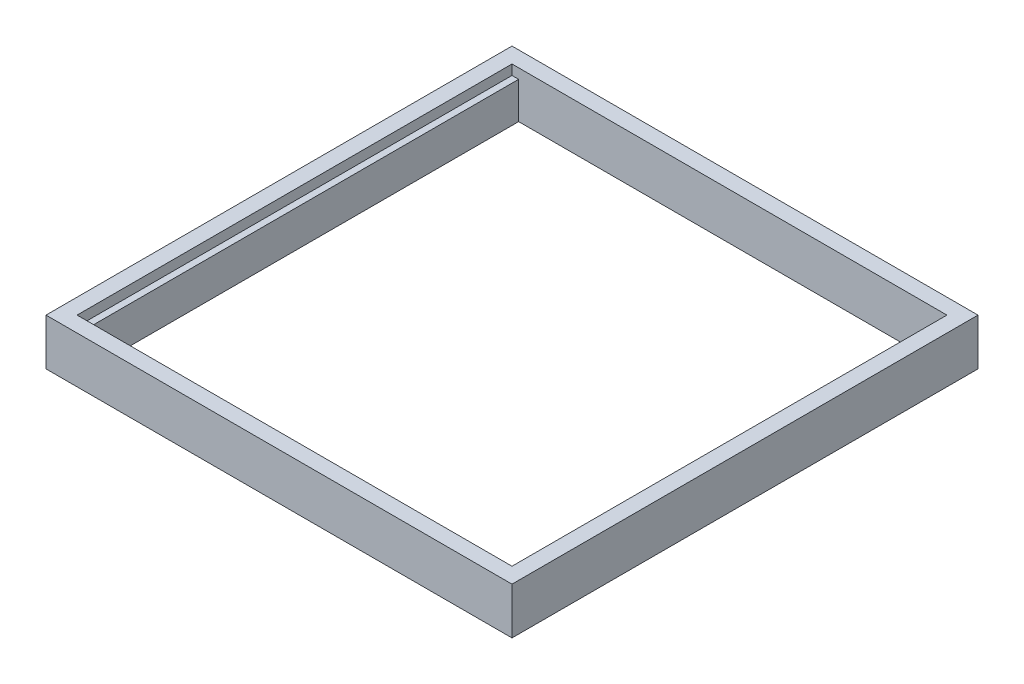
ISO-10303-21;
HEADER;
FILE_DESCRIPTION(('STEP AP214'),'2;1');
FILE_NAME('part.step','',(''),(''),'','','');
FILE_SCHEMA(('AUTOMOTIVE_DESIGN { 1 0 10303 214 1 1 1 1 }'));
ENDSEC;
DATA;
#1=APPLICATION_CONTEXT('core data for automotive mechanical design processes');
#2=APPLICATION_PROTOCOL_DEFINITION('international standard','automotive_design',2000,#1);
#3=PRODUCT_CONTEXT('',#1,'mechanical');
#4=PRODUCT('Part','Part','',(#3));
#5=PRODUCT_RELATED_PRODUCT_CATEGORY('part','',(#4));
#6=PRODUCT_DEFINITION_FORMATION('','',#4);
#7=PRODUCT_DEFINITION_CONTEXT('part definition',#1,'design');
#8=PRODUCT_DEFINITION('design','',#6,#7);
#9=PRODUCT_DEFINITION_SHAPE('','',#8);
#10=(LENGTH_UNIT() NAMED_UNIT(*) SI_UNIT(.MILLI.,.METRE.));
#11=(NAMED_UNIT(*) PLANE_ANGLE_UNIT() SI_UNIT($,.RADIAN.));
#12=(NAMED_UNIT(*) SI_UNIT($,.STERADIAN.) SOLID_ANGLE_UNIT());
#13=UNCERTAINTY_MEASURE_WITH_UNIT(LENGTH_MEASURE(1.E-05),#10,'distance_accuracy_value','');
#14=(GEOMETRIC_REPRESENTATION_CONTEXT(3) GLOBAL_UNCERTAINTY_ASSIGNED_CONTEXT((#13)) GLOBAL_UNIT_ASSIGNED_CONTEXT((#10,
#11,#12)) REPRESENTATION_CONTEXT('',''));
#15=CARTESIAN_POINT('',(0.,0.,0.));
#16=DIRECTION('',(0.,0.,1.));
#17=DIRECTION('',(1.,0.,0.));
#18=AXIS2_PLACEMENT_3D('',#15,#16,#17);
#19=CARTESIAN_POINT('',(0.,5.9,0.));
#20=DIRECTION('',(0.,-1.,0.));
#21=DIRECTION('',(0.,0.,-1.));
#22=AXIS2_PLACEMENT_3D('',#19,#20,#21);
#23=PLANE('',#22);
#24=DIRECTION('',(0.,0.,-1.));
#25=VECTOR('',#24,1.);
#26=CARTESIAN_POINT('',(33.9290042476694,5.9,35.));
#27=LINE('',#26,#25);
#28=CARTESIAN_POINT('',(33.9290042476694,5.9,35.));
#29=VERTEX_POINT('',#28);
#30=CARTESIAN_POINT('',(33.9290042476694,5.9,-35.));
#31=VERTEX_POINT('',#30);
#32=EDGE_CURVE('E148',#29,#31,#27,.T.);
#33=ORIENTED_EDGE('',*,*,#32,.F.);
#34=DIRECTION('',(1.,0.,0.));
#35=VECTOR('',#34,1.);
#36=CARTESIAN_POINT('',(-35.,5.9,35.));
#37=LINE('',#36,#35);
#38=CARTESIAN_POINT('',(35.,5.9,35.));
#39=VERTEX_POINT('',#38);
#40=EDGE_CURVE('E170',#29,#39,#37,.T.);
#41=ORIENTED_EDGE('',*,*,#40,.T.);
#42=DIRECTION('',(0.,0.,-1.));
#43=VECTOR('',#42,1.);
#44=CARTESIAN_POINT('',(35.,5.9,35.));
#45=LINE('',#44,#43);
#46=CARTESIAN_POINT('',(35.,5.9,-35.));
#47=VERTEX_POINT('',#46);
#48=EDGE_CURVE('E160',#39,#47,#45,.T.);
#49=ORIENTED_EDGE('',*,*,#48,.T.);
#50=DIRECTION('',(-1.,0.,0.));
#51=VECTOR('',#50,1.);
#52=CARTESIAN_POINT('',(-35.,5.9,-35.));
#53=LINE('',#52,#51);
#54=EDGE_CURVE('E164',#47,#31,#53,.T.);
#55=ORIENTED_EDGE('',*,*,#54,.T.);
#56=EDGE_LOOP('',(#33,#41,#49,#55));
#57=FACE_BOUND('',#56,.T.);
#58=ADVANCED_FACE('F38',(#57),#23,.F.);
#59=DIRECTION('',(0.,0.,1.));
#60=VECTOR('',#59,1.);
#61=CARTESIAN_POINT('',(-33.9290042476694,5.9,35.));
#62=LINE('',#61,#60);
#63=CARTESIAN_POINT('',(-33.9290042476694,5.9,-35.));
#64=VERTEX_POINT('',#63);
#65=CARTESIAN_POINT('',(-33.9290042476694,5.9,35.));
#66=VERTEX_POINT('',#65);
#67=EDGE_CURVE('E146',#64,#66,#62,.T.);
#68=ORIENTED_EDGE('',*,*,#67,.F.);
#69=CARTESIAN_POINT('',(-35.,5.9,-35.));
#70=VERTEX_POINT('',#69);
#71=EDGE_CURVE('E141',#64,#70,#53,.T.);
#72=ORIENTED_EDGE('',*,*,#71,.T.);
#73=DIRECTION('',(0.,0.,1.));
#74=VECTOR('',#73,1.);
#75=CARTESIAN_POINT('',(-35.,5.9,35.));
#76=LINE('',#75,#74);
#77=CARTESIAN_POINT('',(-35.,5.9,35.));
#78=VERTEX_POINT('',#77);
#79=EDGE_CURVE('E167',#70,#78,#76,.T.);
#80=ORIENTED_EDGE('',*,*,#79,.T.);
#81=EDGE_CURVE('E171',#78,#66,#37,.T.);
#82=ORIENTED_EDGE('',*,*,#81,.T.);
#83=EDGE_LOOP('',(#68,#72,#80,#82));
#84=FACE_BOUND('',#83,.T.);
#85=ADVANCED_FACE('F240',(#84),#23,.F.);
#86=CARTESIAN_POINT('',(37.5,7.5,37.5));
#87=DIRECTION('',(-1.,0.,0.));
#88=DIRECTION('',(0.,0.,1.));
#89=AXIS2_PLACEMENT_3D('',#86,#87,#88);
#90=PLANE('',#89);
#91=DIRECTION('',(0.,0.,-1.));
#92=VECTOR('',#91,1.);
#93=CARTESIAN_POINT('',(37.5,0.,37.5));
#94=LINE('',#93,#92);
#95=CARTESIAN_POINT('',(37.5,0.,37.5));
#96=VERTEX_POINT('',#95);
#97=CARTESIAN_POINT('',(37.5,0.,-37.5));
#98=VERTEX_POINT('',#97);
#99=EDGE_CURVE('E185',#96,#98,#94,.T.);
#100=ORIENTED_EDGE('',*,*,#99,.T.);
#101=DIRECTION('',(0.,-1.,0.));
#102=VECTOR('',#101,1.);
#103=CARTESIAN_POINT('',(37.5,7.5,-37.5));
#104=LINE('',#103,#102);
#105=CARTESIAN_POINT('',(37.5,7.5,-37.5));
#106=VERTEX_POINT('',#105);
#107=EDGE_CURVE('E11',#106,#98,#104,.T.);
#108=ORIENTED_EDGE('',*,*,#107,.F.);
#109=DIRECTION('',(0.,0.,-1.));
#110=VECTOR('',#109,1.);
#111=CARTESIAN_POINT('',(37.5,7.5,37.5));
#112=LINE('',#111,#110);
#113=CARTESIAN_POINT('',(37.5,7.5,37.5));
#114=VERTEX_POINT('',#113);
#115=EDGE_CURVE('E192',#114,#106,#112,.T.);
#116=ORIENTED_EDGE('',*,*,#115,.F.);
#117=DIRECTION('',(0.,-1.,0.));
#118=VECTOR('',#117,1.);
#119=CARTESIAN_POINT('',(37.5,7.5,37.5));
#120=LINE('',#119,#118);
#121=EDGE_CURVE('E202',#114,#96,#120,.T.);
#122=ORIENTED_EDGE('',*,*,#121,.T.);
#123=EDGE_LOOP('',(#100,#108,#116,#122));
#124=FACE_BOUND('',#123,.T.);
#125=ADVANCED_FACE('F40',(#124),#90,.F.);
#126=CARTESIAN_POINT('',(-37.5,7.5,-37.5));
#127=DIRECTION('',(0.,0.,1.));
#128=DIRECTION('',(1.,0.,0.));
#129=AXIS2_PLACEMENT_3D('',#126,#127,#128);
#130=PLANE('',#129);
#131=DIRECTION('',(-1.,0.,0.));
#132=VECTOR('',#131,1.);
#133=CARTESIAN_POINT('',(-37.5,0.,-37.5));
#134=LINE('',#133,#132);
#135=CARTESIAN_POINT('',(-37.5,0.,-37.5));
#136=VERTEX_POINT('',#135);
#137=EDGE_CURVE('E205',#98,#136,#134,.T.);
#138=ORIENTED_EDGE('',*,*,#137,.T.);
#139=DIRECTION('',(0.,-1.,0.));
#140=VECTOR('',#139,1.);
#141=CARTESIAN_POINT('',(-37.5,7.5,-37.5));
#142=LINE('',#141,#140);
#143=CARTESIAN_POINT('',(-37.5,7.5,-37.5));
#144=VERTEX_POINT('',#143);
#145=EDGE_CURVE('E46',#144,#136,#142,.T.);
#146=ORIENTED_EDGE('',*,*,#145,.F.);
#147=DIRECTION('',(-1.,0.,0.));
#148=VECTOR('',#147,1.);
#149=CARTESIAN_POINT('',(-37.5,7.5,-37.5));
#150=LINE('',#149,#148);
#151=EDGE_CURVE('E195',#106,#144,#150,.T.);
#152=ORIENTED_EDGE('',*,*,#151,.F.);
#153=ORIENTED_EDGE('',*,*,#107,.T.);
#154=EDGE_LOOP('',(#138,#146,#152,#153));
#155=FACE_BOUND('',#154,.T.);
#156=ADVANCED_FACE('F233',(#155),#130,.F.);
#157=CARTESIAN_POINT('',(-37.5,7.5,37.5));
#158=DIRECTION('',(1.,0.,0.));
#159=DIRECTION('',(0.,0.,-1.));
#160=AXIS2_PLACEMENT_3D('',#157,#158,#159);
#161=PLANE('',#160);
#162=DIRECTION('',(0.,0.,1.));
#163=VECTOR('',#162,1.);
#164=CARTESIAN_POINT('',(-37.5,0.,37.5));
#165=LINE('',#164,#163);
#166=CARTESIAN_POINT('',(-37.5,0.,37.5));
#167=VERTEX_POINT('',#166);
#168=EDGE_CURVE('E207',#136,#167,#165,.T.);
#169=ORIENTED_EDGE('',*,*,#168,.T.);
#170=DIRECTION('',(0.,-1.,0.));
#171=VECTOR('',#170,1.);
#172=CARTESIAN_POINT('',(-37.5,7.5,37.5));
#173=LINE('',#172,#171);
#174=CARTESIAN_POINT('',(-37.5,7.5,37.5));
#175=VERTEX_POINT('',#174);
#176=EDGE_CURVE('E212',#175,#167,#173,.T.);
#177=ORIENTED_EDGE('',*,*,#176,.F.);
#178=DIRECTION('',(0.,0.,1.));
#179=VECTOR('',#178,1.);
#180=CARTESIAN_POINT('',(-37.5,7.5,37.5));
#181=LINE('',#180,#179);
#182=EDGE_CURVE('E198',#144,#175,#181,.T.);
#183=ORIENTED_EDGE('',*,*,#182,.F.);
#184=ORIENTED_EDGE('',*,*,#145,.T.);
#185=EDGE_LOOP('',(#169,#177,#183,#184));
#186=FACE_BOUND('',#185,.T.);
#187=ADVANCED_FACE('F219',(#186),#161,.F.);
#188=CARTESIAN_POINT('',(-37.5,7.5,37.5));
#189=DIRECTION('',(0.,0.,-1.));
#190=DIRECTION('',(-1.,0.,0.));
#191=AXIS2_PLACEMENT_3D('',#188,#189,#190);
#192=PLANE('',#191);
#193=DIRECTION('',(1.,0.,0.));
#194=VECTOR('',#193,1.);
#195=CARTESIAN_POINT('',(-37.5,0.,37.5));
#196=LINE('',#195,#194);
#197=EDGE_CURVE('E196',#167,#96,#196,.T.);
#198=ORIENTED_EDGE('',*,*,#197,.T.);
#199=ORIENTED_EDGE('',*,*,#121,.F.);
#200=DIRECTION('',(1.,0.,0.));
#201=VECTOR('',#200,1.);
#202=CARTESIAN_POINT('',(-37.5,7.5,37.5));
#203=LINE('',#202,#201);
#204=EDGE_CURVE('E200',#175,#114,#203,.T.);
#205=ORIENTED_EDGE('',*,*,#204,.F.);
#206=ORIENTED_EDGE('',*,*,#176,.T.);
#207=EDGE_LOOP('',(#198,#199,#205,#206));
#208=FACE_BOUND('',#207,.T.);
#209=ADVANCED_FACE('F226',(#208),#192,.F.);
#210=CARTESIAN_POINT('',(0.,7.5,0.));
#211=DIRECTION('',(0.,-1.,0.));
#212=DIRECTION('',(0.,0.,-1.));
#213=AXIS2_PLACEMENT_3D('',#210,#211,#212);
#214=PLANE('',#213);
#215=DIRECTION('',(-1.,0.,0.));
#216=VECTOR('',#215,1.);
#217=CARTESIAN_POINT('',(-35.,7.5,-35.));
#218=LINE('',#217,#216);
#219=CARTESIAN_POINT('',(35.,7.5,-35.));
#220=VERTEX_POINT('',#219);
#221=CARTESIAN_POINT('',(-35.,7.5,-35.));
#222=VERTEX_POINT('',#221);
#223=EDGE_CURVE('E176',#220,#222,#218,.T.);
#224=ORIENTED_EDGE('',*,*,#223,.F.);
#225=DIRECTION('',(0.,0.,-1.));
#226=VECTOR('',#225,1.);
#227=CARTESIAN_POINT('',(35.,7.5,35.));
#228=LINE('',#227,#226);
#229=CARTESIAN_POINT('',(35.,7.5,35.));
#230=VERTEX_POINT('',#229);
#231=EDGE_CURVE('E159',#230,#220,#228,.T.);
#232=ORIENTED_EDGE('',*,*,#231,.F.);
#233=DIRECTION('',(1.,0.,0.));
#234=VECTOR('',#233,1.);
#235=CARTESIAN_POINT('',(-35.,7.5,35.));
#236=LINE('',#235,#234);
#237=CARTESIAN_POINT('',(-35.,7.5,35.));
#238=VERTEX_POINT('',#237);
#239=EDGE_CURVE('E163',#238,#230,#236,.T.);
#240=ORIENTED_EDGE('',*,*,#239,.F.);
#241=DIRECTION('',(0.,0.,1.));
#242=VECTOR('',#241,1.);
#243=CARTESIAN_POINT('',(-35.,7.5,35.));
#244=LINE('',#243,#242);
#245=EDGE_CURVE('E178',#222,#238,#244,.T.);
#246=ORIENTED_EDGE('',*,*,#245,.F.);
#247=EDGE_LOOP('',(#224,#232,#240,#246));
#248=FACE_BOUND('',#247,.T.);
#249=ORIENTED_EDGE('',*,*,#115,.T.);
#250=ORIENTED_EDGE('',*,*,#151,.T.);
#251=ORIENTED_EDGE('',*,*,#182,.T.);
#252=ORIENTED_EDGE('',*,*,#204,.T.);
#253=EDGE_LOOP('',(#249,#250,#251,#252));
#254=FACE_BOUND('',#253,.T.);
#255=ADVANCED_FACE('F232',(#248,#254),#214,.F.);
#256=CARTESIAN_POINT('',(0.,0.,0.));
#257=DIRECTION('',(0.,-1.,0.));
#258=DIRECTION('',(0.,0.,-1.));
#259=AXIS2_PLACEMENT_3D('',#256,#257,#258);
#260=PLANE('',#259);
#261=DIRECTION('',(-1.,0.,0.));
#262=VECTOR('',#261,1.);
#263=CARTESIAN_POINT('',(-33.9290042476694,0.,-35.));
#264=LINE('',#263,#262);
#265=CARTESIAN_POINT('',(33.9290042476694,0.,-35.));
#266=VERTEX_POINT('',#265);
#267=CARTESIAN_POINT('',(-33.9290042476694,0.,-35.));
#268=VERTEX_POINT('',#267);
#269=EDGE_CURVE('E138',#266,#268,#264,.T.);
#270=ORIENTED_EDGE('',*,*,#269,.T.);
#271=DIRECTION('',(0.,0.,1.));
#272=VECTOR('',#271,1.);
#273=CARTESIAN_POINT('',(-33.9290042476694,0.,35.));
#274=LINE('',#273,#272);
#275=CARTESIAN_POINT('',(-33.9290042476694,0.,35.));
#276=VERTEX_POINT('',#275);
#277=EDGE_CURVE('E127',#268,#276,#274,.T.);
#278=ORIENTED_EDGE('',*,*,#277,.T.);
#279=DIRECTION('',(1.,0.,0.));
#280=VECTOR('',#279,1.);
#281=CARTESIAN_POINT('',(-33.9290042476694,0.,35.));
#282=LINE('',#281,#280);
#283=CARTESIAN_POINT('',(33.9290042476694,0.,35.));
#284=VERTEX_POINT('',#283);
#285=EDGE_CURVE('E154',#276,#284,#282,.T.);
#286=ORIENTED_EDGE('',*,*,#285,.T.);
#287=DIRECTION('',(0.,0.,-1.));
#288=VECTOR('',#287,1.);
#289=CARTESIAN_POINT('',(33.9290042476694,0.,35.));
#290=LINE('',#289,#288);
#291=EDGE_CURVE('E145',#284,#266,#290,.T.);
#292=ORIENTED_EDGE('',*,*,#291,.T.);
#293=EDGE_LOOP('',(#270,#278,#286,#292));
#294=FACE_BOUND('',#293,.T.);
#295=ORIENTED_EDGE('',*,*,#99,.F.);
#296=ORIENTED_EDGE('',*,*,#197,.F.);
#297=ORIENTED_EDGE('',*,*,#168,.F.);
#298=ORIENTED_EDGE('',*,*,#137,.F.);
#299=EDGE_LOOP('',(#295,#296,#297,#298));
#300=FACE_BOUND('',#299,.T.);
#301=ADVANCED_FACE('F143',(#294,#300),#260,.T.);
#302=CARTESIAN_POINT('',(35.,5.9,35.));
#303=DIRECTION('',(1.,0.,0.));
#304=DIRECTION('',(0.,0.,-1.));
#305=AXIS2_PLACEMENT_3D('',#302,#303,#304);
#306=PLANE('',#305);
#307=ORIENTED_EDGE('',*,*,#231,.T.);
#308=DIRECTION('',(0.,1.,0.));
#309=VECTOR('',#308,1.);
#310=CARTESIAN_POINT('',(35.,5.9,-35.));
#311=LINE('',#310,#309);
#312=EDGE_CURVE('E174',#47,#220,#311,.T.);
#313=ORIENTED_EDGE('',*,*,#312,.F.);
#314=ORIENTED_EDGE('',*,*,#48,.F.);
#315=DIRECTION('',(0.,1.,0.));
#316=VECTOR('',#315,1.);
#317=CARTESIAN_POINT('',(35.,5.9,35.));
#318=LINE('',#317,#316);
#319=EDGE_CURVE('E183',#39,#230,#318,.T.);
#320=ORIENTED_EDGE('',*,*,#319,.T.);
#321=EDGE_LOOP('',(#307,#313,#314,#320));
#322=FACE_BOUND('',#321,.T.);
#323=ADVANCED_FACE('F257',(#322),#306,.F.);
#324=CARTESIAN_POINT('',(-35.,5.9,35.));
#325=DIRECTION('',(0.,0.,1.));
#326=DIRECTION('',(1.,0.,0.));
#327=AXIS2_PLACEMENT_3D('',#324,#325,#326);
#328=PLANE('',#327);
#329=ORIENTED_EDGE('',*,*,#239,.T.);
#330=ORIENTED_EDGE('',*,*,#319,.F.);
#331=ORIENTED_EDGE('',*,*,#40,.F.);
#332=DIRECTION('',(0.,1.,0.));
#333=VECTOR('',#332,1.);
#334=CARTESIAN_POINT('',(33.9290042476694,-97.4920987411465,35.));
#335=LINE('',#334,#333);
#336=EDGE_CURVE('E153',#284,#29,#335,.T.);
#337=ORIENTED_EDGE('',*,*,#336,.F.);
#338=ORIENTED_EDGE('',*,*,#285,.F.);
#339=DIRECTION('',(0.,1.,0.));
#340=VECTOR('',#339,1.);
#341=CARTESIAN_POINT('',(-33.9290042476694,-97.4920987411465,35.));
#342=LINE('',#341,#340);
#343=EDGE_CURVE('E129',#276,#66,#342,.T.);
#344=ORIENTED_EDGE('',*,*,#343,.T.);
#345=ORIENTED_EDGE('',*,*,#81,.F.);
#346=DIRECTION('',(0.,1.,0.));
#347=VECTOR('',#346,1.);
#348=CARTESIAN_POINT('',(-35.,5.9,35.));
#349=LINE('',#348,#347);
#350=EDGE_CURVE('E186',#78,#238,#349,.T.);
#351=ORIENTED_EDGE('',*,*,#350,.T.);
#352=EDGE_LOOP('',(#329,#330,#331,#337,#338,#344,#345,#351));
#353=FACE_BOUND('',#352,.T.);
#354=ADVANCED_FACE('F253',(#353),#328,.F.);
#355=CARTESIAN_POINT('',(-35.,5.9,35.));
#356=DIRECTION('',(-1.,0.,0.));
#357=DIRECTION('',(0.,0.,1.));
#358=AXIS2_PLACEMENT_3D('',#355,#356,#357);
#359=PLANE('',#358);
#360=ORIENTED_EDGE('',*,*,#245,.T.);
#361=ORIENTED_EDGE('',*,*,#350,.F.);
#362=ORIENTED_EDGE('',*,*,#79,.F.);
#363=DIRECTION('',(0.,1.,0.));
#364=VECTOR('',#363,1.);
#365=CARTESIAN_POINT('',(-35.,5.9,-35.));
#366=LINE('',#365,#364);
#367=EDGE_CURVE('E188',#70,#222,#366,.T.);
#368=ORIENTED_EDGE('',*,*,#367,.T.);
#369=EDGE_LOOP('',(#360,#361,#362,#368));
#370=FACE_BOUND('',#369,.T.);
#371=ADVANCED_FACE('F256',(#370),#359,.F.);
#372=CARTESIAN_POINT('',(-35.,5.9,-35.));
#373=DIRECTION('',(0.,0.,-1.));
#374=DIRECTION('',(-1.,0.,0.));
#375=AXIS2_PLACEMENT_3D('',#372,#373,#374);
#376=PLANE('',#375);
#377=ORIENTED_EDGE('',*,*,#223,.T.);
#378=ORIENTED_EDGE('',*,*,#367,.F.);
#379=ORIENTED_EDGE('',*,*,#71,.F.);
#380=DIRECTION('',(0.,1.,0.));
#381=VECTOR('',#380,1.);
#382=CARTESIAN_POINT('',(-33.9290042476694,-97.4920987411465,-35.));
#383=LINE('',#382,#381);
#384=EDGE_CURVE('E53',#268,#64,#383,.T.);
#385=ORIENTED_EDGE('',*,*,#384,.F.);
#386=ORIENTED_EDGE('',*,*,#269,.F.);
#387=DIRECTION('',(0.,1.,0.));
#388=VECTOR('',#387,1.);
#389=CARTESIAN_POINT('',(33.9290042476694,-97.4920987411465,-35.));
#390=LINE('',#389,#388);
#391=EDGE_CURVE('E61',#266,#31,#390,.T.);
#392=ORIENTED_EDGE('',*,*,#391,.T.);
#393=ORIENTED_EDGE('',*,*,#54,.F.);
#394=ORIENTED_EDGE('',*,*,#312,.T.);
#395=EDGE_LOOP('',(#377,#378,#379,#385,#386,#392,#393,#394));
#396=FACE_BOUND('',#395,.T.);
#397=ADVANCED_FACE('F137',(#396),#376,.F.);
#398=CARTESIAN_POINT('',(-33.9290042476694,-97.4920987411465,35.));
#399=DIRECTION('',(-1.,0.,0.));
#400=DIRECTION('',(0.,0.,1.));
#401=AXIS2_PLACEMENT_3D('',#398,#399,#400);
#402=PLANE('',#401);
#403=ORIENTED_EDGE('',*,*,#384,.T.);
#404=ORIENTED_EDGE('',*,*,#67,.T.);
#405=ORIENTED_EDGE('',*,*,#343,.F.);
#406=ORIENTED_EDGE('',*,*,#277,.F.);
#407=EDGE_LOOP('',(#403,#404,#405,#406));
#408=FACE_BOUND('',#407,.T.);
#409=ADVANCED_FACE('F128',(#408),#402,.F.);
#410=CARTESIAN_POINT('',(33.9290042476694,-97.4920987411465,35.));
#411=DIRECTION('',(1.,0.,0.));
#412=DIRECTION('',(0.,0.,-1.));
#413=AXIS2_PLACEMENT_3D('',#410,#411,#412);
#414=PLANE('',#413);
#415=ORIENTED_EDGE('',*,*,#336,.T.);
#416=ORIENTED_EDGE('',*,*,#32,.T.);
#417=ORIENTED_EDGE('',*,*,#391,.F.);
#418=ORIENTED_EDGE('',*,*,#291,.F.);
#419=EDGE_LOOP('',(#415,#416,#417,#418));
#420=FACE_BOUND('',#419,.T.);
#421=ADVANCED_FACE('F328',(#420),#414,.F.);
#422=CLOSED_SHELL('',(#58,#85,#125,#156,#187,#209,#255,#301,#323,#354,#371,#397,#409,#421));
#423=MANIFOLD_SOLID_BREP('B2',#422);
#424=ADVANCED_BREP_SHAPE_REPRESENTATION('',(#18,#423),#14);
#425=SHAPE_DEFINITION_REPRESENTATION(#9,#424);
ENDSEC;
END-ISO-10303-21;
